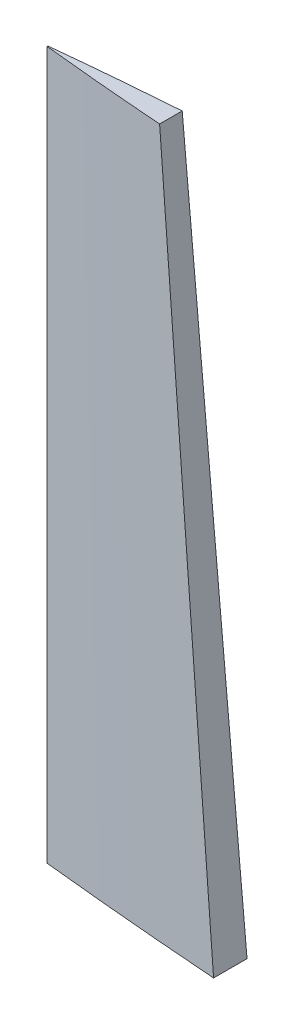
ISO-10303-21;
HEADER;
FILE_DESCRIPTION(('STEP AP214'),'2;1');
FILE_NAME('part.step','',(''),(''),'','','');
FILE_SCHEMA(('AUTOMOTIVE_DESIGN { 1 0 10303 214 1 1 1 1 }'));
ENDSEC;
DATA;
#1=APPLICATION_CONTEXT('core data for automotive mechanical design processes');
#2=APPLICATION_PROTOCOL_DEFINITION('international standard','automotive_design',2000,#1);
#3=PRODUCT_CONTEXT('',#1,'mechanical');
#4=PRODUCT('Part','Part','',(#3));
#5=PRODUCT_RELATED_PRODUCT_CATEGORY('part','',(#4));
#6=PRODUCT_DEFINITION_FORMATION('','',#4);
#7=PRODUCT_DEFINITION_CONTEXT('part definition',#1,'design');
#8=PRODUCT_DEFINITION('design','',#6,#7);
#9=PRODUCT_DEFINITION_SHAPE('','',#8);
#10=(LENGTH_UNIT() NAMED_UNIT(*) SI_UNIT(.MILLI.,.METRE.));
#11=(NAMED_UNIT(*) PLANE_ANGLE_UNIT() SI_UNIT($,.RADIAN.));
#12=(NAMED_UNIT(*) SI_UNIT($,.STERADIAN.) SOLID_ANGLE_UNIT());
#13=UNCERTAINTY_MEASURE_WITH_UNIT(LENGTH_MEASURE(1.E-05),#10,'distance_accuracy_value','');
#14=(GEOMETRIC_REPRESENTATION_CONTEXT(3) GLOBAL_UNCERTAINTY_ASSIGNED_CONTEXT((#13)) GLOBAL_UNIT_ASSIGNED_CONTEXT((#10,
#11,#12)) REPRESENTATION_CONTEXT('',''));
#15=CARTESIAN_POINT('',(0.,0.,0.));
#16=DIRECTION('',(0.,0.,1.));
#17=DIRECTION('',(1.,0.,0.));
#18=AXIS2_PLACEMENT_3D('',#15,#16,#17);
#19=CARTESIAN_POINT('',(-150.171930704996,207.979,-1.66384971869529));
#20=DIRECTION('',(0.,-1.,0.));
#21=DIRECTION('',(0.,0.,-1.));
#22=AXIS2_PLACEMENT_3D('',#19,#20,#21);
#23=PLANE('',#22);
#24=CARTESIAN_POINT('',(-133.938315,207.979,-2.97097352227889));
#25=CARTESIAN_POINT('',(-134.059743160282,207.979,-2.96240548898288));
#26=CARTESIAN_POINT('',(-135.862857688324,207.979,-2.83517680268082));
#27=CARTESIAN_POINT('',(-139.247764887504,207.979,-2.57303980382508));
#28=CARTESIAN_POINT('',(-143.977444359793,207.979,-2.19543695432886));
#29=CARTESIAN_POINT('',(-148.359972021438,207.979,-1.82466928061071));
#30=CARTESIAN_POINT('',(-152.347554380724,207.979,-1.47221301387071));
#31=CARTESIAN_POINT('',(-155.89644487427,207.979,-1.14540868546159));
#32=CARTESIAN_POINT('',(-158.967774140609,207.979,-0.852300614452326));
#33=CARTESIAN_POINT('',(-161.527893990118,207.979,-0.600318934319707));
#34=CARTESIAN_POINT('',(-163.548766329349,207.979,-0.396293610972179));
#35=CARTESIAN_POINT('',(-165.008258459782,207.979,-0.246006189791803));
#36=CARTESIAN_POINT('',(-165.89039744254,207.979,-0.153983916517083));
#37=CARTESIAN_POINT('',(-166.284258811889,207.979,-0.11258058737811));
#38=CARTESIAN_POINT('',(-166.383,207.979,-0.102200757749998));
#39=B_SPLINE_CURVE_WITH_KNOTS('',3,(#24,#25,#26,#27,#28,#29,#30,#31,#32,#33,#34,#35,#36,#37,
#38),.UNSPECIFIED.,.F.,.F.,(4,1,1,1,1,1,1,1,1,1,1,1,4),(0.,0.0112115722778315,0.16648320133775,
0.312686160175411,0.448210552609216,0.571562715657405,0.681381362004341,0.776452466822884,
0.855722863352052,0.918312437422216,0.963524724344559,0.990855635167136,1.),.UNSPECIFIED.);
#40=CARTESIAN_POINT('',(-133.938315,207.979,-2.97097352227889));
#41=VERTEX_POINT('',#40);
#42=CARTESIAN_POINT('',(-166.383,207.979,-0.102200757749998));
#43=VERTEX_POINT('',#42);
#44=EDGE_CURVE('E122',#41,#43,#39,.T.);
#45=ORIENTED_EDGE('',*,*,#44,.T.);
#46=DIRECTION('',(0.,0.,1.));
#47=VECTOR('',#46,1.);
#48=CARTESIAN_POINT('',(-166.383,207.979,-0.102200757749998));
#49=LINE('',#48,#47);
#50=CARTESIAN_POINT('',(-166.383,207.979,0.102200757749998));
#51=VERTEX_POINT('',#50);
#52=EDGE_CURVE('E254',#43,#51,#49,.T.);
#53=ORIENTED_EDGE('',*,*,#52,.T.);
#54=CARTESIAN_POINT('',(-166.383,207.979,0.102200757749998));
#55=CARTESIAN_POINT('',(-166.284258811889,207.979,0.11258058737811));
#56=CARTESIAN_POINT('',(-165.89039744254,207.979,0.153983916517083));
#57=CARTESIAN_POINT('',(-165.008258459782,207.979,0.246006189791803));
#58=CARTESIAN_POINT('',(-163.548766329349,207.979,0.396293610972179));
#59=CARTESIAN_POINT('',(-161.527893990118,207.979,0.600318934319707));
#60=CARTESIAN_POINT('',(-158.967774140609,207.979,0.852300614452326));
#61=CARTESIAN_POINT('',(-155.89644487427,207.979,1.14540868546159));
#62=CARTESIAN_POINT('',(-152.347554380724,207.979,1.47221301387071));
#63=CARTESIAN_POINT('',(-148.359972021438,207.979,1.82466928061071));
#64=CARTESIAN_POINT('',(-143.977444359793,207.979,2.19543695432886));
#65=CARTESIAN_POINT('',(-139.247764887504,207.979,2.57303980382508));
#66=CARTESIAN_POINT('',(-135.862857688324,207.979,2.83517680268082));
#67=CARTESIAN_POINT('',(-134.059743160282,207.979,2.96240548898288));
#68=CARTESIAN_POINT('',(-133.938315,207.979,2.97097352227889));
#69=B_SPLINE_CURVE_WITH_KNOTS('',3,(#54,#55,#56,#57,#58,#59,#60,#61,#62,#63,#64,#65,#66,#67,
#68),.UNSPECIFIED.,.F.,.F.,(4,1,1,1,1,1,1,1,1,1,1,1,4),(0.,0.00914436483286396,
0.0364752756554412,0.081687562577784,0.144277136647948,0.223547533177116,0.318618637995659,
0.428437284342595,0.551789447390784,0.687313839824589,0.83351679866225,0.988788427722169,1.),.UNSPECIFIED.);
#70=CARTESIAN_POINT('',(-133.938315,207.979,2.97097352227889));
#71=VERTEX_POINT('',#70);
#72=EDGE_CURVE('E79',#51,#71,#69,.T.);
#73=ORIENTED_EDGE('',*,*,#72,.T.);
#74=DIRECTION('',(0.,0.,-1.));
#75=VECTOR('',#74,1.);
#76=CARTESIAN_POINT('',(-133.938315,207.979,-2.97097352227889));
#77=LINE('',#76,#75);
#78=EDGE_CURVE('E12',#71,#41,#77,.T.);
#79=ORIENTED_EDGE('',*,*,#78,.T.);
#80=EDGE_LOOP('',(#45,#53,#73,#79));
#81=FACE_BOUND('',#80,.T.);
#82=ADVANCED_FACE('F69',(#81),#23,.F.);
#83=CARTESIAN_POINT('',(-142.366250177743,22.,-2.46499855799475));
#84=DIRECTION('',(0.,-1.,0.));
#85=DIRECTION('',(0.,0.,-1.));
#86=AXIS2_PLACEMENT_3D('',#83,#84,#85);
#87=PLANE('',#86);
#88=CARTESIAN_POINT('',(-118.316097778622,22.,-4.40150655793647));
#89=CARTESIAN_POINT('',(-118.495993977559,22.,-4.3888129898322));
#90=CARTESIAN_POINT('',(-121.167313785821,22.,-4.20032329346944));
#91=CARTESIAN_POINT('',(-126.182064379683,22.,-3.8119665104523));
#92=CARTESIAN_POINT('',(-133.189099298745,22.,-3.25254670886543));
#93=CARTESIAN_POINT('',(-139.681827725444,22.,-2.70325324155459));
#94=CARTESIAN_POINT('',(-145.589443452442,22.,-2.1810881809074));
#95=CARTESIAN_POINT('',(-150.847135809377,22.,-1.69692654706309));
#96=CARTESIAN_POINT('',(-155.397319715762,22.,-1.26268602386186));
#97=CARTESIAN_POINT('',(-159.19014527352,22.,-0.889374377269723));
#98=CARTESIAN_POINT('',(-162.184073959579,22.,-0.587110223124577));
#99=CARTESIAN_POINT('',(-164.34631611192,22.,-0.364458938978025));
#100=CARTESIAN_POINT('',(-165.653207771676,22.,-0.228127653539912));
#101=CARTESIAN_POINT('',(-166.236714621234,22.,-0.16678849202971));
#102=CARTESIAN_POINT('',(-166.383,22.,-0.151410741997338));
#103=B_SPLINE_CURVE_WITH_KNOTS('',3,(#88,#89,#90,#91,#92,#93,#94,#95,#96,#97,#98,#99,#100,#101,
#102),.UNSPECIFIED.,.F.,.F.,(4,1,1,1,1,1,1,1,1,1,1,1,4),(0.,0.0112115722778321,
0.166483201337751,0.312686160175411,0.448210552609216,0.571562715657405,0.681381362004342,
0.776452466822885,0.855722863352053,0.918312437422216,0.963524724344559,0.990855635167136,1.),.UNSPECIFIED.);
#104=CARTESIAN_POINT('',(-118.316097778622,22.,-4.40150655793647));
#105=VERTEX_POINT('',#104);
#106=CARTESIAN_POINT('',(-166.383,22.,-0.151410741997338));
#107=VERTEX_POINT('',#106);
#108=EDGE_CURVE('E119',#105,#107,#103,.T.);
#109=ORIENTED_EDGE('',*,*,#108,.F.);
#110=DIRECTION('',(0.,0.,-1.));
#111=VECTOR('',#110,1.);
#112=CARTESIAN_POINT('',(-118.316097778622,22.,-4.40150655793647));
#113=LINE('',#112,#111);
#114=CARTESIAN_POINT('',(-118.316097778622,22.,4.40150655793647));
#115=VERTEX_POINT('',#114);
#116=EDGE_CURVE('E126',#115,#105,#113,.T.);
#117=ORIENTED_EDGE('',*,*,#116,.F.);
#118=CARTESIAN_POINT('',(-166.383,22.,0.151410741997338));
#119=CARTESIAN_POINT('',(-166.236714621234,22.,0.16678849202971));
#120=CARTESIAN_POINT('',(-165.653207771676,22.,0.228127653539912));
#121=CARTESIAN_POINT('',(-164.34631611192,22.,0.364458938978025));
#122=CARTESIAN_POINT('',(-162.184073959579,22.,0.587110223124577));
#123=CARTESIAN_POINT('',(-159.19014527352,22.,0.889374377269723));
#124=CARTESIAN_POINT('',(-155.397319715762,22.,1.26268602386186));
#125=CARTESIAN_POINT('',(-150.847135809377,22.,1.69692654706309));
#126=CARTESIAN_POINT('',(-145.589443452442,22.,2.1810881809074));
#127=CARTESIAN_POINT('',(-139.681827725444,22.,2.70325324155459));
#128=CARTESIAN_POINT('',(-133.189099298745,22.,3.25254670886543));
#129=CARTESIAN_POINT('',(-126.182064379683,22.,3.8119665104523));
#130=CARTESIAN_POINT('',(-121.167313785821,22.,4.20032329346944));
#131=CARTESIAN_POINT('',(-118.495993977559,22.,4.3888129898322));
#132=CARTESIAN_POINT('',(-118.316097778622,22.,4.40150655793647));
#133=B_SPLINE_CURVE_WITH_KNOTS('',3,(#118,#119,#120,#121,#122,#123,#124,#125,#126,#127,#128,
#129,#130,#131,#132),.UNSPECIFIED.,.F.,.F.,(4,1,1,1,1,1,1,1,1,1,1,1,4),(0.,0.00914436483286363,
0.0364752756554414,0.0816875625777841,0.144277136647947,0.223547533177115,0.318618637995658,
0.428437284342595,0.551789447390784,0.687313839824589,0.833516798662249,0.988788427722168,1.),.UNSPECIFIED.);
#134=CARTESIAN_POINT('',(-166.383,22.,0.151410741997338));
#135=VERTEX_POINT('',#134);
#136=EDGE_CURVE('E132',#135,#115,#133,.T.);
#137=ORIENTED_EDGE('',*,*,#136,.F.);
#138=DIRECTION('',(0.,0.,1.));
#139=VECTOR('',#138,1.);
#140=CARTESIAN_POINT('',(-166.383,22.,-0.151410741997338));
#141=LINE('',#140,#139);
#142=EDGE_CURVE('E138',#107,#135,#141,.T.);
#143=ORIENTED_EDGE('',*,*,#142,.F.);
#144=EDGE_LOOP('',(#109,#117,#137,#143));
#145=FACE_BOUND('',#144,.T.);
#146=ADVANCED_FACE('F136',(#145),#87,.T.);
#147=CARTESIAN_POINT('',(-118.316097778622,22.,-4.40150655793647));
#148=CARTESIAN_POINT('',(-133.938315,207.979,-2.97097352227889));
#149=CARTESIAN_POINT('',(-118.495993977559,22.,-4.3888129898322));
#150=CARTESIAN_POINT('',(-134.059743160282,207.979,-2.96240548898288));
#151=CARTESIAN_POINT('',(-121.167313785821,22.,-4.20032329346944));
#152=CARTESIAN_POINT('',(-135.862857688324,207.979,-2.83517680268082));
#153=CARTESIAN_POINT('',(-126.182064379683,22.,-3.8119665104523));
#154=CARTESIAN_POINT('',(-139.247764887504,207.979,-2.57303980382508));
#155=CARTESIAN_POINT('',(-133.189099298745,22.,-3.25254670886543));
#156=CARTESIAN_POINT('',(-143.977444359793,207.979,-2.19543695432886));
#157=CARTESIAN_POINT('',(-139.681827725444,22.,-2.70325324155459));
#158=CARTESIAN_POINT('',(-148.359972021438,207.979,-1.82466928061071));
#159=CARTESIAN_POINT('',(-145.589443452442,22.,-2.1810881809074));
#160=CARTESIAN_POINT('',(-152.347554380724,207.979,-1.47221301387071));
#161=CARTESIAN_POINT('',(-150.847135809377,22.,-1.69692654706309));
#162=CARTESIAN_POINT('',(-155.89644487427,207.979,-1.14540868546159));
#163=CARTESIAN_POINT('',(-155.397319715762,22.,-1.26268602386186));
#164=CARTESIAN_POINT('',(-158.967774140609,207.979,-0.852300614452326));
#165=CARTESIAN_POINT('',(-159.19014527352,22.,-0.889374377269723));
#166=CARTESIAN_POINT('',(-161.527893990118,207.979,-0.600318934319707));
#167=CARTESIAN_POINT('',(-162.184073959579,22.,-0.587110223124577));
#168=CARTESIAN_POINT('',(-163.548766329349,207.979,-0.396293610972179));
#169=CARTESIAN_POINT('',(-164.34631611192,22.,-0.364458938978025));
#170=CARTESIAN_POINT('',(-165.008258459782,207.979,-0.246006189791803));
#171=CARTESIAN_POINT('',(-165.653207771676,22.,-0.228127653539912));
#172=CARTESIAN_POINT('',(-165.89039744254,207.979,-0.153983916517083));
#173=CARTESIAN_POINT('',(-166.236714621234,22.,-0.16678849202971));
#174=CARTESIAN_POINT('',(-166.284258811889,207.979,-0.11258058737811));
#175=CARTESIAN_POINT('',(-166.383,22.,-0.151410741997338));
#176=CARTESIAN_POINT('',(-166.383,207.979,-0.102200757749998));
#177=B_SPLINE_SURFACE_WITH_KNOTS('',3,1,((#147,#148),(#149,#150),(#151,#152),(#153,#154),(#155,
#156),(#157,#158),(#159,#160),(#161,#162),(#163,#164),(#165,#166),(#167,#168),(#169,#170),(#171,
#172),(#173,#174),(#175,#176)),.UNSPECIFIED.,.F.,.F.,.F.,(4,1,1,1,1,1,1,1,1,1,1,1,4),(2,2),(0.,
0.0112115722778315,0.166483201337751,0.312686160175411,0.448210552609216,0.571562715657405,
0.681381362004342,0.776452466822885,0.855722863352053,0.918312437422216,0.963524724344559,
0.990855635167136,1.),(0.,1.),.UNSPECIFIED.);
#178=DIRECTION('',(0.,0.999999964993506,0.00026459967267633));
#179=VECTOR('',#178,1.);
#180=CARTESIAN_POINT('',(-166.383,114.9895,-0.126805749873668));
#181=LINE('',#180,#179);
#182=EDGE_CURVE('E125',#107,#43,#181,.T.);
#183=DIRECTION('',(0.0837026484515057,-0.996461298403924,-0.00766468690616173));
#184=VECTOR('',#183,1.);
#185=CARTESIAN_POINT('',(-126.127206389311,114.9895,-3.68624004010768));
#186=LINE('',#185,#184);
#187=EDGE_CURVE('E114',#41,#105,#186,.T.);
#188=ORIENTED_EDGE('',*,*,#108,.T.);
#189=ORIENTED_EDGE('',*,*,#182,.T.);
#190=ORIENTED_EDGE('',*,*,#44,.F.);
#191=ORIENTED_EDGE('',*,*,#187,.T.);
#192=EDGE_LOOP('',(#188,#189,#190,#191));
#193=FACE_BOUND('',#192,.T.);
#194=ADVANCED_FACE('F116',(#193),#177,.T.);
#195=CARTESIAN_POINT('',(-166.383,0.,0.));
#196=DIRECTION('',(1.,0.,0.));
#197=DIRECTION('',(0.,0.,-1.));
#198=AXIS2_PLACEMENT_3D('',#195,#196,#197);
#199=PLANE('',#198);
#200=DIRECTION('',(0.,0.999999964993506,-0.00026459967267633));
#201=VECTOR('',#200,1.);
#202=CARTESIAN_POINT('',(-166.383,22.,0.151410741997338));
#203=LINE('',#202,#201);
#204=EDGE_CURVE('E272',#135,#51,#203,.T.);
#205=ORIENTED_EDGE('',*,*,#204,.T.);
#206=ORIENTED_EDGE('',*,*,#52,.F.);
#207=ORIENTED_EDGE('',*,*,#182,.F.);
#208=ORIENTED_EDGE('',*,*,#142,.T.);
#209=EDGE_LOOP('',(#205,#206,#207,#208));
#210=FACE_BOUND('',#209,.T.);
#211=ADVANCED_FACE('F257',(#210),#199,.F.);
#212=CARTESIAN_POINT('',(-115.652061019282,-9.71476144803067,0.));
#213=DIRECTION('',(-0.996490569461511,-0.0837051072173874,0.));
#214=DIRECTION('',(0.0837051072173874,-0.996490569461511,0.));
#215=AXIS2_PLACEMENT_3D('',#212,#213,#214);
#216=PLANE('',#215);
#217=ORIENTED_EDGE('',*,*,#187,.F.);
#218=ORIENTED_EDGE('',*,*,#78,.F.);
#219=DIRECTION('',(-0.0837026484515057,0.996461298403924,-0.00766468690616173));
#220=VECTOR('',#219,1.);
#221=CARTESIAN_POINT('',(-126.127206389311,114.9895,3.68624004010768));
#222=LINE('',#221,#220);
#223=EDGE_CURVE('E87',#115,#71,#222,.T.);
#224=ORIENTED_EDGE('',*,*,#223,.F.);
#225=ORIENTED_EDGE('',*,*,#116,.T.);
#226=EDGE_LOOP('',(#217,#218,#224,#225));
#227=FACE_BOUND('',#226,.T.);
#228=ADVANCED_FACE('F129',(#227),#216,.F.);
#229=CARTESIAN_POINT('',(-166.383,22.,0.151410741997338));
#230=CARTESIAN_POINT('',(-166.383,207.979,0.102200757749998));
#231=CARTESIAN_POINT('',(-166.236714621234,22.,0.16678849202971));
#232=CARTESIAN_POINT('',(-166.284258811889,207.979,0.11258058737811));
#233=CARTESIAN_POINT('',(-165.653207771676,22.,0.228127653539912));
#234=CARTESIAN_POINT('',(-165.89039744254,207.979,0.153983916517083));
#235=CARTESIAN_POINT('',(-164.34631611192,22.,0.364458938978025));
#236=CARTESIAN_POINT('',(-165.008258459782,207.979,0.246006189791803));
#237=CARTESIAN_POINT('',(-162.184073959579,22.,0.587110223124577));
#238=CARTESIAN_POINT('',(-163.548766329349,207.979,0.396293610972179));
#239=CARTESIAN_POINT('',(-159.19014527352,22.,0.889374377269723));
#240=CARTESIAN_POINT('',(-161.527893990118,207.979,0.600318934319707));
#241=CARTESIAN_POINT('',(-155.397319715762,22.,1.26268602386186));
#242=CARTESIAN_POINT('',(-158.967774140609,207.979,0.852300614452326));
#243=CARTESIAN_POINT('',(-150.847135809377,22.,1.69692654706309));
#244=CARTESIAN_POINT('',(-155.89644487427,207.979,1.14540868546159));
#245=CARTESIAN_POINT('',(-145.589443452442,22.,2.1810881809074));
#246=CARTESIAN_POINT('',(-152.347554380724,207.979,1.47221301387071));
#247=CARTESIAN_POINT('',(-139.681827725444,22.,2.70325324155459));
#248=CARTESIAN_POINT('',(-148.359972021438,207.979,1.82466928061071));
#249=CARTESIAN_POINT('',(-133.189099298745,22.,3.25254670886543));
#250=CARTESIAN_POINT('',(-143.977444359793,207.979,2.19543695432886));
#251=CARTESIAN_POINT('',(-126.182064379683,22.,3.8119665104523));
#252=CARTESIAN_POINT('',(-139.247764887504,207.979,2.57303980382508));
#253=CARTESIAN_POINT('',(-121.167313785821,22.,4.20032329346944));
#254=CARTESIAN_POINT('',(-135.862857688324,207.979,2.83517680268082));
#255=CARTESIAN_POINT('',(-118.495993977559,22.,4.3888129898322));
#256=CARTESIAN_POINT('',(-134.059743160282,207.979,2.96240548898288));
#257=CARTESIAN_POINT('',(-118.316097778622,22.,4.40150655793647));
#258=CARTESIAN_POINT('',(-133.938315,207.979,2.97097352227889));
#259=B_SPLINE_SURFACE_WITH_KNOTS('',3,1,((#229,#230),(#231,#232),(#233,#234),(#235,#236),(#237,
#238),(#239,#240),(#241,#242),(#243,#244),(#245,#246),(#247,#248),(#249,#250),(#251,#252),(#253,
#254),(#255,#256),(#257,#258)),.UNSPECIFIED.,.F.,.F.,.F.,(4,1,1,1,1,1,1,1,1,1,1,1,4),(2,2),(0.,
0.00914436483286363,0.0364752756554414,0.0816875625777841,0.144277136647947,0.223547533177115,
0.318618637995658,0.428437284342595,0.551789447390784,0.687313839824589,0.833516798662249,
0.988788427722168,1.),(0.,1.),.UNSPECIFIED.);
#260=ORIENTED_EDGE('',*,*,#136,.T.);
#261=ORIENTED_EDGE('',*,*,#223,.T.);
#262=ORIENTED_EDGE('',*,*,#72,.F.);
#263=ORIENTED_EDGE('',*,*,#204,.F.);
#264=EDGE_LOOP('',(#260,#261,#262,#263));
#265=FACE_BOUND('',#264,.T.);
#266=ADVANCED_FACE('F205',(#265),#259,.T.);
#267=CLOSED_SHELL('',(#82,#146,#194,#211,#228,#266));
#268=MANIFOLD_SOLID_BREP('B2',#267);
#269=ADVANCED_BREP_SHAPE_REPRESENTATION('',(#18,#268),#14);
#270=SHAPE_DEFINITION_REPRESENTATION(#9,#269);
ENDSEC;
END-ISO-10303-21;
